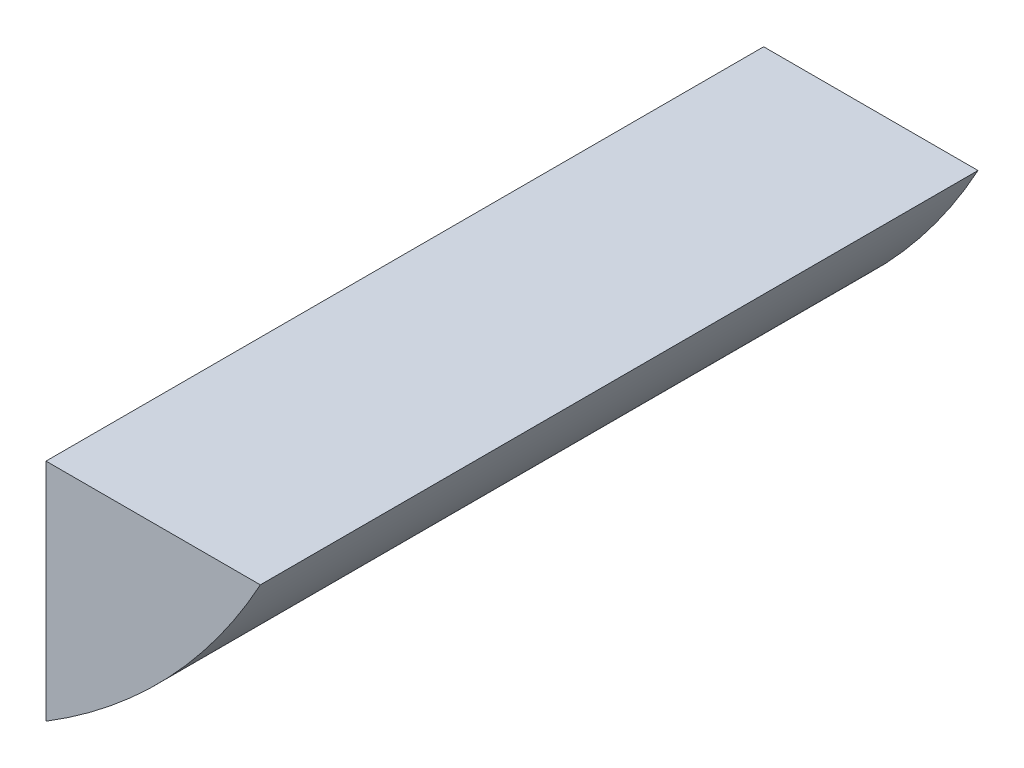
ISO-10303-21;
HEADER;
FILE_DESCRIPTION(('STEP AP214'),'2;1');
FILE_NAME('part.step','',(''),(''),'','','');
FILE_SCHEMA(('AUTOMOTIVE_DESIGN { 1 0 10303 214 1 1 1 1 }'));
ENDSEC;
DATA;
#1=APPLICATION_CONTEXT('core data for automotive mechanical design processes');
#2=APPLICATION_PROTOCOL_DEFINITION('international standard','automotive_design',2000,#1);
#3=PRODUCT_CONTEXT('',#1,'mechanical');
#4=PRODUCT('Part','Part','',(#3));
#5=PRODUCT_RELATED_PRODUCT_CATEGORY('part','',(#4));
#6=PRODUCT_DEFINITION_FORMATION('','',#4);
#7=PRODUCT_DEFINITION_CONTEXT('part definition',#1,'design');
#8=PRODUCT_DEFINITION('design','',#6,#7);
#9=PRODUCT_DEFINITION_SHAPE('','',#8);
#10=(LENGTH_UNIT() NAMED_UNIT(*) SI_UNIT(.MILLI.,.METRE.));
#11=(NAMED_UNIT(*) PLANE_ANGLE_UNIT() SI_UNIT($,.RADIAN.));
#12=(NAMED_UNIT(*) SI_UNIT($,.STERADIAN.) SOLID_ANGLE_UNIT());
#13=UNCERTAINTY_MEASURE_WITH_UNIT(LENGTH_MEASURE(1.E-05),#10,'distance_accuracy_value','');
#14=(GEOMETRIC_REPRESENTATION_CONTEXT(3) GLOBAL_UNCERTAINTY_ASSIGNED_CONTEXT((#13)) GLOBAL_UNIT_ASSIGNED_CONTEXT((#10,
#11,#12)) REPRESENTATION_CONTEXT('',''));
#15=CARTESIAN_POINT('',(0.,0.,0.));
#16=DIRECTION('',(0.,0.,1.));
#17=DIRECTION('',(1.,0.,0.));
#18=AXIS2_PLACEMENT_3D('',#15,#16,#17);
#19=CARTESIAN_POINT('',(18.0264052530704,0.,50.));
#20=DIRECTION('',(1.,0.,0.));
#21=DIRECTION('',(0.,0.,-1.));
#22=AXIS2_PLACEMENT_3D('',#19,#20,#21);
#23=PLANE('',#22);
#24=DIRECTION('',(0.,-1.,0.));
#25=VECTOR('',#24,1.);
#26=CARTESIAN_POINT('',(18.0264052530704,0.,0.));
#27=LINE('',#26,#25);
#28=CARTESIAN_POINT('',(18.0264052530704,-19.1814600505968,0.));
#29=VERTEX_POINT('',#28);
#30=CARTESIAN_POINT('',(18.0264052530704,-34.8794752691863,0.));
#31=VERTEX_POINT('',#30);
#32=EDGE_CURVE('E82',#29,#31,#27,.T.);
#33=ORIENTED_EDGE('',*,*,#32,.T.);
#34=DIRECTION('',(0.,0.,-1.));
#35=VECTOR('',#34,1.);
#36=CARTESIAN_POINT('',(18.0264052530704,-34.8794752691863,50.));
#37=LINE('',#36,#35);
#38=CARTESIAN_POINT('',(18.0264052530704,-34.8794752691863,50.));
#39=VERTEX_POINT('',#38);
#40=EDGE_CURVE('E11',#39,#31,#37,.T.);
#41=ORIENTED_EDGE('',*,*,#40,.F.);
#42=DIRECTION('',(0.,-1.,0.));
#43=VECTOR('',#42,1.);
#44=CARTESIAN_POINT('',(18.0264052530704,0.,50.));
#45=LINE('',#44,#43);
#46=CARTESIAN_POINT('',(18.0264052530704,-19.1814600505968,50.));
#47=VERTEX_POINT('',#46);
#48=EDGE_CURVE('E75',#47,#39,#45,.T.);
#49=ORIENTED_EDGE('',*,*,#48,.F.);
#50=DIRECTION('',(0.,0.,-1.));
#51=VECTOR('',#50,1.);
#52=CARTESIAN_POINT('',(18.0264052530704,-19.1814600505968,50.));
#53=LINE('',#52,#51);
#54=EDGE_CURVE('E83',#47,#29,#53,.T.);
#55=ORIENTED_EDGE('',*,*,#54,.T.);
#56=EDGE_LOOP('',(#33,#41,#49,#55));
#57=FACE_BOUND('',#56,.T.);
#58=ADVANCED_FACE('F35',(#57),#23,.F.);
#59=CARTESIAN_POINT('',(-3.98286472163062,1.00926997470219,50.));
#60=DIRECTION('',(0.,0.,-1.));
#61=DIRECTION('',(-1.,0.,0.));
#62=AXIS2_PLACEMENT_3D('',#59,#60,#61);
#63=CYLINDRICAL_SURFACE('',#62,42.1);
#64=CARTESIAN_POINT('',(-3.98286472163062,1.00926997470219,0.));
#65=DIRECTION('',(0.,0.,1.));
#66=DIRECTION('',(1.,0.,0.));
#67=AXIS2_PLACEMENT_3D('',#64,#65,#66);
#68=CIRCLE('',#67,42.1);
#69=CARTESIAN_POINT('',(32.9595826938492,-19.1814600505968,0.));
#70=VERTEX_POINT('',#69);
#71=EDGE_CURVE('E63',#31,#70,#68,.T.);
#72=ORIENTED_EDGE('',*,*,#71,.T.);
#73=DIRECTION('',(0.,0.,-1.));
#74=VECTOR('',#73,1.);
#75=CARTESIAN_POINT('',(32.9595826938492,-19.1814600505968,50.));
#76=LINE('',#75,#74);
#77=CARTESIAN_POINT('',(32.9595826938492,-19.1814600505968,50.));
#78=VERTEX_POINT('',#77);
#79=EDGE_CURVE('E43',#78,#70,#76,.T.);
#80=ORIENTED_EDGE('',*,*,#79,.F.);
#81=CARTESIAN_POINT('',(-3.98286472163062,1.00926997470219,50.));
#82=DIRECTION('',(0.,0.,1.));
#83=DIRECTION('',(1.,0.,0.));
#84=AXIS2_PLACEMENT_3D('',#81,#82,#83);
#85=CIRCLE('',#84,42.1);
#86=EDGE_CURVE('E71',#39,#78,#85,.T.);
#87=ORIENTED_EDGE('',*,*,#86,.F.);
#88=ORIENTED_EDGE('',*,*,#40,.T.);
#89=EDGE_LOOP('',(#72,#80,#87,#88));
#90=FACE_BOUND('',#89,.T.);
#91=ADVANCED_FACE('F72',(#90),#63,.T.);
#92=CARTESIAN_POINT('',(0.,-19.1814600505968,50.));
#93=DIRECTION('',(0.,-1.,0.));
#94=DIRECTION('',(0.,0.,-1.));
#95=AXIS2_PLACEMENT_3D('',#92,#93,#94);
#96=PLANE('',#95);
#97=DIRECTION('',(-1.,0.,0.));
#98=VECTOR('',#97,1.);
#99=CARTESIAN_POINT('',(0.,-19.1814600505968,0.));
#100=LINE('',#99,#98);
#101=EDGE_CURVE('E68',#70,#29,#100,.T.);
#102=ORIENTED_EDGE('',*,*,#101,.T.);
#103=ORIENTED_EDGE('',*,*,#54,.F.);
#104=DIRECTION('',(-1.,0.,0.));
#105=VECTOR('',#104,1.);
#106=CARTESIAN_POINT('',(0.,-19.1814600505968,50.));
#107=LINE('',#106,#105);
#108=EDGE_CURVE('E51',#78,#47,#107,.T.);
#109=ORIENTED_EDGE('',*,*,#108,.F.);
#110=ORIENTED_EDGE('',*,*,#79,.T.);
#111=EDGE_LOOP('',(#102,#103,#109,#110));
#112=FACE_BOUND('',#111,.T.);
#113=ADVANCED_FACE('F90',(#112),#96,.F.);
#114=CARTESIAN_POINT('',(0.,0.,50.));
#115=DIRECTION('',(0.,0.,1.));
#116=DIRECTION('',(1.,0.,0.));
#117=AXIS2_PLACEMENT_3D('',#114,#115,#116);
#118=PLANE('',#117);
#119=ORIENTED_EDGE('',*,*,#48,.T.);
#120=ORIENTED_EDGE('',*,*,#86,.T.);
#121=ORIENTED_EDGE('',*,*,#108,.T.);
#122=EDGE_LOOP('',(#119,#120,#121));
#123=FACE_BOUND('',#122,.T.);
#124=ADVANCED_FACE('F78',(#123),#118,.T.);
#125=CARTESIAN_POINT('',(0.,0.,0.));
#126=DIRECTION('',(0.,0.,1.));
#127=DIRECTION('',(1.,0.,0.));
#128=AXIS2_PLACEMENT_3D('',#125,#126,#127);
#129=PLANE('',#128);
#130=ORIENTED_EDGE('',*,*,#32,.F.);
#131=ORIENTED_EDGE('',*,*,#101,.F.);
#132=ORIENTED_EDGE('',*,*,#71,.F.);
#133=EDGE_LOOP('',(#130,#131,#132));
#134=FACE_BOUND('',#133,.T.);
#135=ADVANCED_FACE('F91',(#134),#129,.F.);
#136=CLOSED_SHELL('',(#58,#91,#113,#124,#135));
#137=MANIFOLD_SOLID_BREP('B2',#136);
#138=ADVANCED_BREP_SHAPE_REPRESENTATION('',(#18,#137),#14);
#139=SHAPE_DEFINITION_REPRESENTATION(#9,#138);
ENDSEC;
END-ISO-10303-21;
